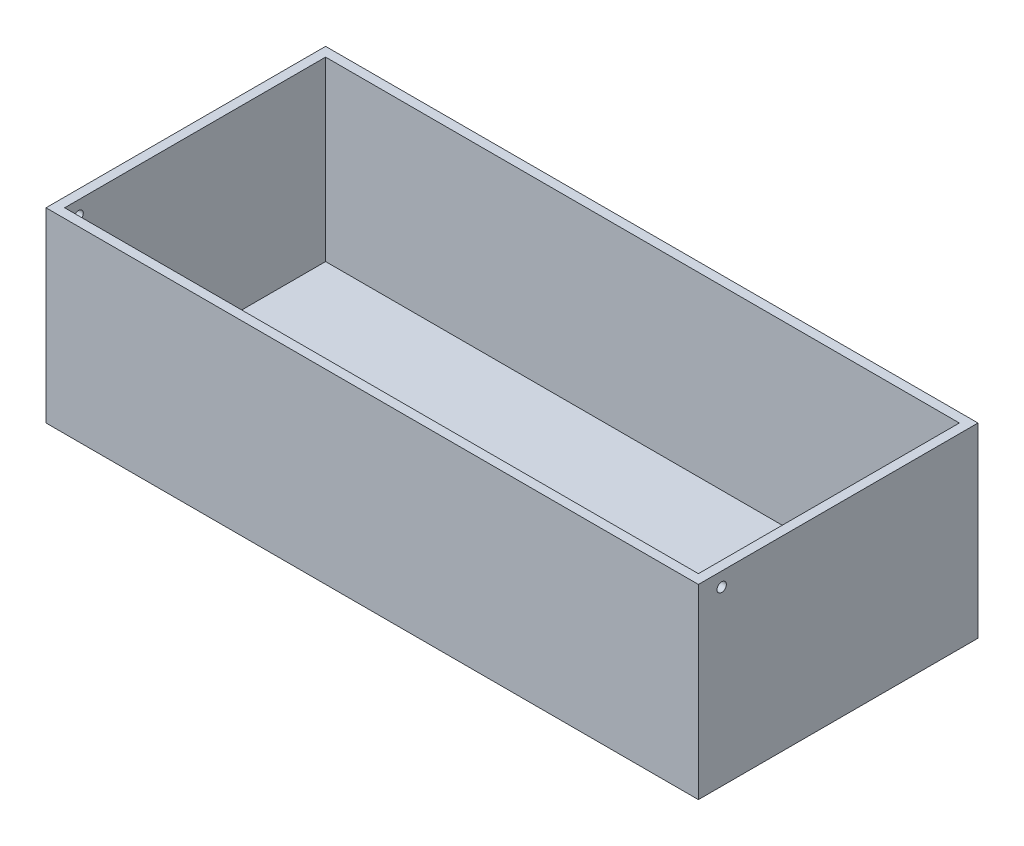
ISO-10303-21;
HEADER;
FILE_DESCRIPTION(('STEP AP214'),'2;1');
FILE_NAME('part.step','',(''),(''),'','','');
FILE_SCHEMA(('AUTOMOTIVE_DESIGN { 1 0 10303 214 1 1 1 1 }'));
ENDSEC;
DATA;
#1=APPLICATION_CONTEXT('core data for automotive mechanical design processes');
#2=APPLICATION_PROTOCOL_DEFINITION('international standard','automotive_design',2000,#1);
#3=PRODUCT_CONTEXT('',#1,'mechanical');
#4=PRODUCT('Part','Part','',(#3));
#5=PRODUCT_RELATED_PRODUCT_CATEGORY('part','',(#4));
#6=PRODUCT_DEFINITION_FORMATION('','',#4);
#7=PRODUCT_DEFINITION_CONTEXT('part definition',#1,'design');
#8=PRODUCT_DEFINITION('design','',#6,#7);
#9=PRODUCT_DEFINITION_SHAPE('','',#8);
#10=(LENGTH_UNIT() NAMED_UNIT(*) SI_UNIT(.MILLI.,.METRE.));
#11=(NAMED_UNIT(*) PLANE_ANGLE_UNIT() SI_UNIT($,.RADIAN.));
#12=(NAMED_UNIT(*) SI_UNIT($,.STERADIAN.) SOLID_ANGLE_UNIT());
#13=UNCERTAINTY_MEASURE_WITH_UNIT(LENGTH_MEASURE(1.E-05),#10,'distance_accuracy_value','');
#14=(GEOMETRIC_REPRESENTATION_CONTEXT(3) GLOBAL_UNCERTAINTY_ASSIGNED_CONTEXT((#13)) GLOBAL_UNIT_ASSIGNED_CONTEXT((#10,
#11,#12)) REPRESENTATION_CONTEXT('',''));
#15=CARTESIAN_POINT('',(0.,0.,0.));
#16=DIRECTION('',(0.,0.,1.));
#17=DIRECTION('',(1.,0.,0.));
#18=AXIS2_PLACEMENT_3D('',#15,#16,#17);
#19=CARTESIAN_POINT('',(350.,200.,150.));
#20=DIRECTION('',(-1.,0.,0.));
#21=DIRECTION('',(0.,0.,1.));
#22=AXIS2_PLACEMENT_3D('',#19,#20,#21);
#23=PLANE('',#22);
#24=CARTESIAN_POINT('',(350.,185.,125.));
#25=DIRECTION('',(1.,0.,0.));
#26=DIRECTION('',(0.,0.,-1.));
#27=AXIS2_PLACEMENT_3D('',#24,#25,#26);
#28=CIRCLE('',#27,4.99999999999999);
#29=CARTESIAN_POINT('',(350.,185.,120.));
#30=VERTEX_POINT('',#29);
#31=EDGE_CURVE('E199',#30,#30,#28,.T.);
#32=ORIENTED_EDGE('',*,*,#31,.F.);
#33=EDGE_LOOP('',(#32));
#34=FACE_BOUND('',#33,.T.);
#35=DIRECTION('',(0.,0.,-1.));
#36=VECTOR('',#35,1.);
#37=CARTESIAN_POINT('',(350.,0.,150.));
#38=LINE('',#37,#36);
#39=CARTESIAN_POINT('',(350.,0.,150.));
#40=VERTEX_POINT('',#39);
#41=CARTESIAN_POINT('',(350.,0.,-150.));
#42=VERTEX_POINT('',#41);
#43=EDGE_CURVE('E145',#40,#42,#38,.T.);
#44=ORIENTED_EDGE('',*,*,#43,.T.);
#45=DIRECTION('',(0.,-1.,0.));
#46=VECTOR('',#45,1.);
#47=CARTESIAN_POINT('',(350.,200.,-150.));
#48=LINE('',#47,#46);
#49=CARTESIAN_POINT('',(350.,200.,-150.));
#50=VERTEX_POINT('',#49);
#51=EDGE_CURVE('E11',#50,#42,#48,.T.);
#52=ORIENTED_EDGE('',*,*,#51,.F.);
#53=DIRECTION('',(0.,0.,-1.));
#54=VECTOR('',#53,1.);
#55=CARTESIAN_POINT('',(350.,200.,150.));
#56=LINE('',#55,#54);
#57=CARTESIAN_POINT('',(350.,200.,150.));
#58=VERTEX_POINT('',#57);
#59=EDGE_CURVE('E149',#58,#50,#56,.T.);
#60=ORIENTED_EDGE('',*,*,#59,.F.);
#61=DIRECTION('',(0.,-1.,0.));
#62=VECTOR('',#61,1.);
#63=CARTESIAN_POINT('',(350.,200.,150.));
#64=LINE('',#63,#62);
#65=EDGE_CURVE('E155',#58,#40,#64,.T.);
#66=ORIENTED_EDGE('',*,*,#65,.T.);
#67=EDGE_LOOP('',(#44,#52,#60,#66));
#68=FACE_BOUND('',#67,.T.);
#69=ADVANCED_FACE('F33',(#34,#68),#23,.F.);
#70=CARTESIAN_POINT('',(-350.,200.,-150.));
#71=DIRECTION('',(0.,0.,1.));
#72=DIRECTION('',(1.,0.,0.));
#73=AXIS2_PLACEMENT_3D('',#70,#71,#72);
#74=PLANE('',#73);
#75=DIRECTION('',(-1.,0.,0.));
#76=VECTOR('',#75,1.);
#77=CARTESIAN_POINT('',(-350.,0.,-150.));
#78=LINE('',#77,#76);
#79=CARTESIAN_POINT('',(-350.,0.,-150.));
#80=VERTEX_POINT('',#79);
#81=EDGE_CURVE('E158',#42,#80,#78,.T.);
#82=ORIENTED_EDGE('',*,*,#81,.T.);
#83=DIRECTION('',(0.,-1.,0.));
#84=VECTOR('',#83,1.);
#85=CARTESIAN_POINT('',(-350.,200.,-150.));
#86=LINE('',#85,#84);
#87=CARTESIAN_POINT('',(-350.,200.,-150.));
#88=VERTEX_POINT('',#87);
#89=EDGE_CURVE('E41',#88,#80,#86,.T.);
#90=ORIENTED_EDGE('',*,*,#89,.F.);
#91=DIRECTION('',(-1.,0.,0.));
#92=VECTOR('',#91,1.);
#93=CARTESIAN_POINT('',(-350.,200.,-150.));
#94=LINE('',#93,#92);
#95=EDGE_CURVE('E85',#50,#88,#94,.T.);
#96=ORIENTED_EDGE('',*,*,#95,.F.);
#97=ORIENTED_EDGE('',*,*,#51,.T.);
#98=EDGE_LOOP('',(#82,#90,#96,#97));
#99=FACE_BOUND('',#98,.T.);
#100=ADVANCED_FACE('F188',(#99),#74,.F.);
#101=CARTESIAN_POINT('',(-350.,200.,150.));
#102=DIRECTION('',(1.,0.,0.));
#103=DIRECTION('',(0.,0.,-1.));
#104=AXIS2_PLACEMENT_3D('',#101,#102,#103);
#105=PLANE('',#104);
#106=CARTESIAN_POINT('',(-350.,185.,125.));
#107=DIRECTION('',(1.,0.,0.));
#108=DIRECTION('',(0.,0.,-1.));
#109=AXIS2_PLACEMENT_3D('',#106,#107,#108);
#110=CIRCLE('',#109,4.99999999999999);
#111=CARTESIAN_POINT('',(-350.,185.,120.));
#112=VERTEX_POINT('',#111);
#113=EDGE_CURVE('E201',#112,#112,#110,.T.);
#114=ORIENTED_EDGE('',*,*,#113,.T.);
#115=EDGE_LOOP('',(#114));
#116=FACE_BOUND('',#115,.T.);
#117=DIRECTION('',(0.,0.,1.));
#118=VECTOR('',#117,1.);
#119=CARTESIAN_POINT('',(-350.,0.,150.));
#120=LINE('',#119,#118);
#121=CARTESIAN_POINT('',(-350.,0.,150.));
#122=VERTEX_POINT('',#121);
#123=EDGE_CURVE('E160',#80,#122,#120,.T.);
#124=ORIENTED_EDGE('',*,*,#123,.T.);
#125=DIRECTION('',(0.,-1.,0.));
#126=VECTOR('',#125,1.);
#127=CARTESIAN_POINT('',(-350.,200.,150.));
#128=LINE('',#127,#126);
#129=CARTESIAN_POINT('',(-350.,200.,150.));
#130=VERTEX_POINT('',#129);
#131=EDGE_CURVE('E164',#130,#122,#128,.T.);
#132=ORIENTED_EDGE('',*,*,#131,.F.);
#133=DIRECTION('',(0.,0.,1.));
#134=VECTOR('',#133,1.);
#135=CARTESIAN_POINT('',(-350.,200.,150.));
#136=LINE('',#135,#134);
#137=EDGE_CURVE('E152',#88,#130,#136,.T.);
#138=ORIENTED_EDGE('',*,*,#137,.F.);
#139=ORIENTED_EDGE('',*,*,#89,.T.);
#140=EDGE_LOOP('',(#124,#132,#138,#139));
#141=FACE_BOUND('',#140,.T.);
#142=ADVANCED_FACE('F170',(#116,#141),#105,.F.);
#143=CARTESIAN_POINT('',(-350.,200.,150.));
#144=DIRECTION('',(0.,0.,-1.));
#145=DIRECTION('',(-1.,0.,0.));
#146=AXIS2_PLACEMENT_3D('',#143,#144,#145);
#147=PLANE('',#146);
#148=DIRECTION('',(1.,0.,0.));
#149=VECTOR('',#148,1.);
#150=CARTESIAN_POINT('',(-350.,0.,150.));
#151=LINE('',#150,#149);
#152=EDGE_CURVE('E78',#122,#40,#151,.T.);
#153=ORIENTED_EDGE('',*,*,#152,.T.);
#154=ORIENTED_EDGE('',*,*,#65,.F.);
#155=DIRECTION('',(1.,0.,0.));
#156=VECTOR('',#155,1.);
#157=CARTESIAN_POINT('',(-350.,200.,150.));
#158=LINE('',#157,#156);
#159=EDGE_CURVE('E57',#130,#58,#158,.T.);
#160=ORIENTED_EDGE('',*,*,#159,.F.);
#161=ORIENTED_EDGE('',*,*,#131,.T.);
#162=EDGE_LOOP('',(#153,#154,#160,#161));
#163=FACE_BOUND('',#162,.T.);
#164=ADVANCED_FACE('F178',(#163),#147,.F.);
#165=CARTESIAN_POINT('',(0.,200.,0.));
#166=DIRECTION('',(0.,-1.,0.));
#167=DIRECTION('',(0.,0.,-1.));
#168=AXIS2_PLACEMENT_3D('',#165,#166,#167);
#169=PLANE('',#168);
#170=DIRECTION('',(-1.,0.,0.));
#171=VECTOR('',#170,1.);
#172=CARTESIAN_POINT('',(-340.,200.,-140.));
#173=LINE('',#172,#171);
#174=CARTESIAN_POINT('',(340.,200.,-140.));
#175=VERTEX_POINT('',#174);
#176=CARTESIAN_POINT('',(-340.,200.,-140.));
#177=VERTEX_POINT('',#176);
#178=EDGE_CURVE('E139',#175,#177,#173,.T.);
#179=ORIENTED_EDGE('',*,*,#178,.F.);
#180=DIRECTION('',(0.,0.,-1.));
#181=VECTOR('',#180,1.);
#182=CARTESIAN_POINT('',(340.,200.,140.));
#183=LINE('',#182,#181);
#184=CARTESIAN_POINT('',(340.,200.,140.));
#185=VERTEX_POINT('',#184);
#186=EDGE_CURVE('E48',#185,#175,#183,.T.);
#187=ORIENTED_EDGE('',*,*,#186,.F.);
#188=DIRECTION('',(1.,0.,0.));
#189=VECTOR('',#188,1.);
#190=CARTESIAN_POINT('',(-340.,200.,140.));
#191=LINE('',#190,#189);
#192=CARTESIAN_POINT('',(-340.,200.,140.));
#193=VERTEX_POINT('',#192);
#194=EDGE_CURVE('E127',#193,#185,#191,.T.);
#195=ORIENTED_EDGE('',*,*,#194,.F.);
#196=DIRECTION('',(0.,0.,1.));
#197=VECTOR('',#196,1.);
#198=CARTESIAN_POINT('',(-340.,200.,140.));
#199=LINE('',#198,#197);
#200=EDGE_CURVE('E130',#177,#193,#199,.T.);
#201=ORIENTED_EDGE('',*,*,#200,.F.);
#202=EDGE_LOOP('',(#179,#187,#195,#201));
#203=FACE_BOUND('',#202,.T.);
#204=ORIENTED_EDGE('',*,*,#59,.T.);
#205=ORIENTED_EDGE('',*,*,#95,.T.);
#206=ORIENTED_EDGE('',*,*,#137,.T.);
#207=ORIENTED_EDGE('',*,*,#159,.T.);
#208=EDGE_LOOP('',(#204,#205,#206,#207));
#209=FACE_BOUND('',#208,.T.);
#210=ADVANCED_FACE('F180',(#203,#209),#169,.F.);
#211=CARTESIAN_POINT('',(0.,0.,0.));
#212=DIRECTION('',(0.,-1.,0.));
#213=DIRECTION('',(0.,0.,-1.));
#214=AXIS2_PLACEMENT_3D('',#211,#212,#213);
#215=PLANE('',#214);
#216=ORIENTED_EDGE('',*,*,#43,.F.);
#217=ORIENTED_EDGE('',*,*,#152,.F.);
#218=ORIENTED_EDGE('',*,*,#123,.F.);
#219=ORIENTED_EDGE('',*,*,#81,.F.);
#220=EDGE_LOOP('',(#216,#217,#218,#219));
#221=FACE_BOUND('',#220,.T.);
#222=ADVANCED_FACE('F174',(#221),#215,.T.);
#223=CARTESIAN_POINT('',(340.,10.,140.));
#224=DIRECTION('',(1.,0.,0.));
#225=DIRECTION('',(0.,0.,-1.));
#226=AXIS2_PLACEMENT_3D('',#223,#224,#225);
#227=PLANE('',#226);
#228=CARTESIAN_POINT('',(340.,185.,125.));
#229=DIRECTION('',(1.,0.,0.));
#230=DIRECTION('',(0.,0.,-1.));
#231=AXIS2_PLACEMENT_3D('',#228,#229,#230);
#232=CIRCLE('',#231,4.99999999999999);
#233=CARTESIAN_POINT('',(340.,185.,120.));
#234=VERTEX_POINT('',#233);
#235=EDGE_CURVE('E133',#234,#234,#232,.T.);
#236=ORIENTED_EDGE('',*,*,#235,.T.);
#237=EDGE_LOOP('',(#236));
#238=FACE_BOUND('',#237,.T.);
#239=ORIENTED_EDGE('',*,*,#186,.T.);
#240=DIRECTION('',(0.,1.,0.));
#241=VECTOR('',#240,1.);
#242=CARTESIAN_POINT('',(340.,10.,-140.));
#243=LINE('',#242,#241);
#244=CARTESIAN_POINT('',(340.,10.,-140.));
#245=VERTEX_POINT('',#244);
#246=EDGE_CURVE('E105',#245,#175,#243,.T.);
#247=ORIENTED_EDGE('',*,*,#246,.F.);
#248=DIRECTION('',(0.,0.,-1.));
#249=VECTOR('',#248,1.);
#250=CARTESIAN_POINT('',(340.,10.,140.));
#251=LINE('',#250,#249);
#252=CARTESIAN_POINT('',(340.,10.,140.));
#253=VERTEX_POINT('',#252);
#254=EDGE_CURVE('E109',#253,#245,#251,.T.);
#255=ORIENTED_EDGE('',*,*,#254,.F.);
#256=DIRECTION('',(0.,1.,0.));
#257=VECTOR('',#256,1.);
#258=CARTESIAN_POINT('',(340.,10.,140.));
#259=LINE('',#258,#257);
#260=EDGE_CURVE('E143',#253,#185,#259,.T.);
#261=ORIENTED_EDGE('',*,*,#260,.T.);
#262=EDGE_LOOP('',(#239,#247,#255,#261));
#263=FACE_BOUND('',#262,.T.);
#264=ADVANCED_FACE('F107',(#238,#263),#227,.F.);
#265=CARTESIAN_POINT('',(-340.,10.,140.));
#266=DIRECTION('',(0.,0.,1.));
#267=DIRECTION('',(1.,0.,0.));
#268=AXIS2_PLACEMENT_3D('',#265,#266,#267);
#269=PLANE('',#268);
#270=ORIENTED_EDGE('',*,*,#194,.T.);
#271=ORIENTED_EDGE('',*,*,#260,.F.);
#272=DIRECTION('',(1.,0.,0.));
#273=VECTOR('',#272,1.);
#274=CARTESIAN_POINT('',(-340.,10.,140.));
#275=LINE('',#274,#273);
#276=CARTESIAN_POINT('',(-340.,10.,140.));
#277=VERTEX_POINT('',#276);
#278=EDGE_CURVE('E115',#277,#253,#275,.T.);
#279=ORIENTED_EDGE('',*,*,#278,.F.);
#280=DIRECTION('',(0.,1.,0.));
#281=VECTOR('',#280,1.);
#282=CARTESIAN_POINT('',(-340.,10.,140.));
#283=LINE('',#282,#281);
#284=EDGE_CURVE('E146',#277,#193,#283,.T.);
#285=ORIENTED_EDGE('',*,*,#284,.T.);
#286=EDGE_LOOP('',(#270,#271,#279,#285));
#287=FACE_BOUND('',#286,.T.);
#288=ADVANCED_FACE('F223',(#287),#269,.F.);
#289=CARTESIAN_POINT('',(-340.,10.,140.));
#290=DIRECTION('',(-1.,0.,0.));
#291=DIRECTION('',(0.,0.,1.));
#292=AXIS2_PLACEMENT_3D('',#289,#290,#291);
#293=PLANE('',#292);
#294=CARTESIAN_POINT('',(-340.,185.,125.));
#295=DIRECTION('',(-1.,0.,0.));
#296=DIRECTION('',(0.,0.,1.));
#297=AXIS2_PLACEMENT_3D('',#294,#295,#296);
#298=CIRCLE('',#297,4.99999999999999);
#299=CARTESIAN_POINT('',(-340.,185.,130.));
#300=VERTEX_POINT('',#299);
#301=EDGE_CURVE('E36',#300,#300,#298,.T.);
#302=ORIENTED_EDGE('',*,*,#301,.T.);
#303=EDGE_LOOP('',(#302));
#304=FACE_BOUND('',#303,.T.);
#305=ORIENTED_EDGE('',*,*,#200,.T.);
#306=ORIENTED_EDGE('',*,*,#284,.F.);
#307=DIRECTION('',(0.,0.,1.));
#308=VECTOR('',#307,1.);
#309=CARTESIAN_POINT('',(-340.,10.,140.));
#310=LINE('',#309,#308);
#311=CARTESIAN_POINT('',(-340.,10.,-140.));
#312=VERTEX_POINT('',#311);
#313=EDGE_CURVE('E123',#312,#277,#310,.T.);
#314=ORIENTED_EDGE('',*,*,#313,.F.);
#315=DIRECTION('',(0.,1.,0.));
#316=VECTOR('',#315,1.);
#317=CARTESIAN_POINT('',(-340.,10.,-140.));
#318=LINE('',#317,#316);
#319=EDGE_CURVE('E114',#312,#177,#318,.T.);
#320=ORIENTED_EDGE('',*,*,#319,.T.);
#321=EDGE_LOOP('',(#305,#306,#314,#320));
#322=FACE_BOUND('',#321,.T.);
#323=ADVANCED_FACE('F226',(#304,#322),#293,.F.);
#324=CARTESIAN_POINT('',(-340.,10.,-140.));
#325=DIRECTION('',(0.,0.,-1.));
#326=DIRECTION('',(-1.,0.,0.));
#327=AXIS2_PLACEMENT_3D('',#324,#325,#326);
#328=PLANE('',#327);
#329=ORIENTED_EDGE('',*,*,#178,.T.);
#330=ORIENTED_EDGE('',*,*,#319,.F.);
#331=DIRECTION('',(-1.,0.,0.));
#332=VECTOR('',#331,1.);
#333=CARTESIAN_POINT('',(-340.,10.,-140.));
#334=LINE('',#333,#332);
#335=EDGE_CURVE('E118',#245,#312,#334,.T.);
#336=ORIENTED_EDGE('',*,*,#335,.F.);
#337=ORIENTED_EDGE('',*,*,#246,.T.);
#338=EDGE_LOOP('',(#329,#330,#336,#337));
#339=FACE_BOUND('',#338,.T.);
#340=ADVANCED_FACE('F119',(#339),#328,.F.);
#341=CARTESIAN_POINT('',(0.,10.,0.));
#342=DIRECTION('',(0.,-1.,0.));
#343=DIRECTION('',(0.,0.,-1.));
#344=AXIS2_PLACEMENT_3D('',#341,#342,#343);
#345=PLANE('',#344);
#346=ORIENTED_EDGE('',*,*,#254,.T.);
#347=ORIENTED_EDGE('',*,*,#335,.T.);
#348=ORIENTED_EDGE('',*,*,#313,.T.);
#349=ORIENTED_EDGE('',*,*,#278,.T.);
#350=EDGE_LOOP('',(#346,#347,#348,#349));
#351=FACE_BOUND('',#350,.T.);
#352=ADVANCED_FACE('F125',(#351),#345,.F.);
#353=CARTESIAN_POINT('',(-350.,185.,125.));
#354=DIRECTION('',(1.,0.,0.));
#355=DIRECTION('',(0.,0.,-1.));
#356=AXIS2_PLACEMENT_3D('',#353,#354,#355);
#357=CYLINDRICAL_SURFACE('',#356,4.99999999999999);
#358=ORIENTED_EDGE('',*,*,#113,.F.);
#359=EDGE_LOOP('',(#358));
#360=FACE_BOUND('',#359,.T.);
#361=ORIENTED_EDGE('',*,*,#301,.F.);
#362=EDGE_LOOP('',(#361));
#363=FACE_BOUND('',#362,.T.);
#364=ADVANCED_FACE('F214',(#360,#363),#357,.F.);
#365=ORIENTED_EDGE('',*,*,#31,.T.);
#366=EDGE_LOOP('',(#365));
#367=FACE_BOUND('',#366,.T.);
#368=ORIENTED_EDGE('',*,*,#235,.F.);
#369=EDGE_LOOP('',(#368));
#370=FACE_BOUND('',#369,.T.);
#371=ADVANCED_FACE('F212',(#367,#370),#357,.F.);
#372=CLOSED_SHELL('',(#69,#100,#142,#164,#210,#222,#264,#288,#323,#340,#352,#364,#371));
#373=MANIFOLD_SOLID_BREP('B2',#372);
#374=ADVANCED_BREP_SHAPE_REPRESENTATION('',(#18,#373),#14);
#375=SHAPE_DEFINITION_REPRESENTATION(#9,#374);
ENDSEC;
END-ISO-10303-21;
